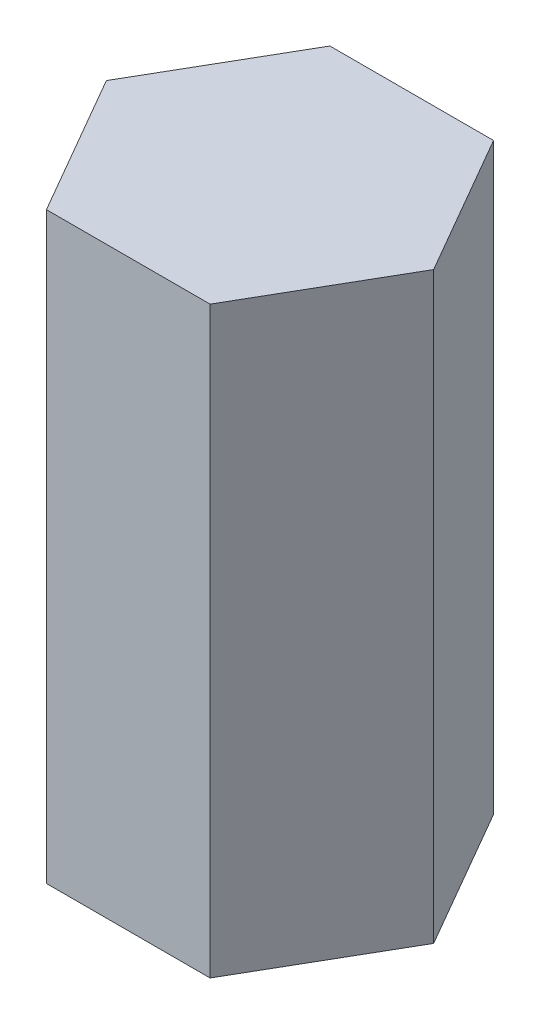
ISO-10303-21;
HEADER;
FILE_DESCRIPTION(('STEP AP214'),'2;1');
FILE_NAME('part.step','',(''),(''),'','','');
FILE_SCHEMA(('AUTOMOTIVE_DESIGN { 1 0 10303 214 1 1 1 1 }'));
ENDSEC;
DATA;
#1=APPLICATION_CONTEXT('core data for automotive mechanical design processes');
#2=APPLICATION_PROTOCOL_DEFINITION('international standard','automotive_design',2000,#1);
#3=PRODUCT_CONTEXT('',#1,'mechanical');
#4=PRODUCT('Part','Part','',(#3));
#5=PRODUCT_RELATED_PRODUCT_CATEGORY('part','',(#4));
#6=PRODUCT_DEFINITION_FORMATION('','',#4);
#7=PRODUCT_DEFINITION_CONTEXT('part definition',#1,'design');
#8=PRODUCT_DEFINITION('design','',#6,#7);
#9=PRODUCT_DEFINITION_SHAPE('','',#8);
#10=(LENGTH_UNIT() NAMED_UNIT(*) SI_UNIT(.MILLI.,.METRE.));
#11=(NAMED_UNIT(*) PLANE_ANGLE_UNIT() SI_UNIT($,.RADIAN.));
#12=(NAMED_UNIT(*) SI_UNIT($,.STERADIAN.) SOLID_ANGLE_UNIT());
#13=UNCERTAINTY_MEASURE_WITH_UNIT(LENGTH_MEASURE(1.E-05),#10,'distance_accuracy_value','');
#14=(GEOMETRIC_REPRESENTATION_CONTEXT(3) GLOBAL_UNCERTAINTY_ASSIGNED_CONTEXT((#13)) GLOBAL_UNIT_ASSIGNED_CONTEXT((#10,
#11,#12)) REPRESENTATION_CONTEXT('',''));
#15=CARTESIAN_POINT('',(0.,0.,0.));
#16=DIRECTION('',(0.,0.,1.));
#17=DIRECTION('',(1.,0.,0.));
#18=AXIS2_PLACEMENT_3D('',#15,#16,#17);
#19=CARTESIAN_POINT('',(0.,0.,0.));
#20=DIRECTION('',(0.,1.,0.));
#21=DIRECTION('',(0.,0.,1.));
#22=AXIS2_PLACEMENT_3D('',#19,#20,#21);
#23=PLANE('',#22);
#24=DIRECTION('',(1.,0.,0.));
#25=VECTOR('',#24,1.);
#26=CARTESIAN_POINT('',(0.,0.,8.50000000000001));
#27=LINE('',#26,#25);
#28=CARTESIAN_POINT('',(-4.90747728811181,0.,8.50000000000001));
#29=VERTEX_POINT('',#28);
#30=CARTESIAN_POINT('',(4.90747728811182,0.,8.50000000000001));
#31=VERTEX_POINT('',#30);
#32=EDGE_CURVE('E138',#29,#31,#27,.T.);
#33=ORIENTED_EDGE('',*,*,#32,.F.);
#34=DIRECTION('',(0.5,0.,0.866025403784439));
#35=VECTOR('',#34,1.);
#36=CARTESIAN_POINT('',(-7.36121593216772,0.,4.25));
#37=LINE('',#36,#35);
#38=CARTESIAN_POINT('',(-9.81495457622363,0.,0.));
#39=VERTEX_POINT('',#38);
#40=EDGE_CURVE('E134',#39,#29,#37,.T.);
#41=ORIENTED_EDGE('',*,*,#40,.F.);
#42=DIRECTION('',(-0.5,0.,0.866025403784439));
#43=VECTOR('',#42,1.);
#44=CARTESIAN_POINT('',(-4.90747728811182,0.,-8.5));
#45=LINE('',#44,#43);
#46=CARTESIAN_POINT('',(-4.90747728811182,0.,-8.5));
#47=VERTEX_POINT('',#46);
#48=EDGE_CURVE('E136',#47,#39,#45,.T.);
#49=ORIENTED_EDGE('',*,*,#48,.F.);
#50=DIRECTION('',(-1.,0.,0.));
#51=VECTOR('',#50,1.);
#52=CARTESIAN_POINT('',(4.90747728811182,0.,-8.5));
#53=LINE('',#52,#51);
#54=CARTESIAN_POINT('',(4.90747728811182,0.,-8.5));
#55=VERTEX_POINT('',#54);
#56=EDGE_CURVE('E128',#55,#47,#53,.T.);
#57=ORIENTED_EDGE('',*,*,#56,.F.);
#58=DIRECTION('',(-0.5,0.,-0.866025403784439));
#59=VECTOR('',#58,1.);
#60=CARTESIAN_POINT('',(9.81495457622364,0.,0.));
#61=LINE('',#60,#59);
#62=CARTESIAN_POINT('',(9.81495457622364,0.,0.));
#63=VERTEX_POINT('',#62);
#64=EDGE_CURVE('E189',#63,#55,#61,.T.);
#65=ORIENTED_EDGE('',*,*,#64,.F.);
#66=DIRECTION('',(0.5,0.,-0.866025403784439));
#67=VECTOR('',#66,1.);
#68=CARTESIAN_POINT('',(7.36121593216773,0.,4.25));
#69=LINE('',#68,#67);
#70=EDGE_CURVE('E144',#31,#63,#69,.T.);
#71=ORIENTED_EDGE('',*,*,#70,.F.);
#72=EDGE_LOOP('',(#33,#41,#49,#57,#65,#71));
#73=FACE_BOUND('',#72,.T.);
#74=ADVANCED_FACE('F75',(#73),#23,.F.);
#75=CARTESIAN_POINT('',(0.,35.,8.50000000000001));
#76=DIRECTION('',(0.,0.,-1.));
#77=DIRECTION('',(-1.,0.,0.));
#78=AXIS2_PLACEMENT_3D('',#75,#76,#77);
#79=PLANE('',#78);
#80=ORIENTED_EDGE('',*,*,#32,.T.);
#81=DIRECTION('',(0.,-1.,0.));
#82=VECTOR('',#81,1.);
#83=CARTESIAN_POINT('',(4.90747728811182,35.,8.50000000000001));
#84=LINE('',#83,#82);
#85=CARTESIAN_POINT('',(4.90747728811182,35.,8.50000000000001));
#86=VERTEX_POINT('',#85);
#87=EDGE_CURVE('E12',#86,#31,#84,.T.);
#88=ORIENTED_EDGE('',*,*,#87,.F.);
#89=DIRECTION('',(1.,0.,0.));
#90=VECTOR('',#89,1.);
#91=CARTESIAN_POINT('',(0.,35.,8.50000000000001));
#92=LINE('',#91,#90);
#93=CARTESIAN_POINT('',(-4.90747728811181,35.,8.50000000000001));
#94=VERTEX_POINT('',#93);
#95=EDGE_CURVE('E143',#94,#86,#92,.T.);
#96=ORIENTED_EDGE('',*,*,#95,.F.);
#97=DIRECTION('',(0.,-1.,0.));
#98=VECTOR('',#97,1.);
#99=CARTESIAN_POINT('',(-4.90747728811181,35.,8.50000000000001));
#100=LINE('',#99,#98);
#101=EDGE_CURVE('E86',#94,#29,#100,.T.);
#102=ORIENTED_EDGE('',*,*,#101,.T.);
#103=EDGE_LOOP('',(#80,#88,#96,#102));
#104=FACE_BOUND('',#103,.T.);
#105=ADVANCED_FACE('F197',(#104),#79,.F.);
#106=CARTESIAN_POINT('',(-7.36121593216772,35.,4.25));
#107=DIRECTION('',(0.866025403784439,0.,-0.5));
#108=DIRECTION('',(-0.5,0.,-0.866025403784439));
#109=AXIS2_PLACEMENT_3D('',#106,#107,#108);
#110=PLANE('',#109);
#111=ORIENTED_EDGE('',*,*,#40,.T.);
#112=ORIENTED_EDGE('',*,*,#101,.F.);
#113=DIRECTION('',(0.5,0.,0.866025403784439));
#114=VECTOR('',#113,1.);
#115=CARTESIAN_POINT('',(-7.36121593216772,35.,4.25));
#116=LINE('',#115,#114);
#117=CARTESIAN_POINT('',(-9.81495457622363,35.,0.));
#118=VERTEX_POINT('',#117);
#119=EDGE_CURVE('E95',#118,#94,#116,.T.);
#120=ORIENTED_EDGE('',*,*,#119,.F.);
#121=DIRECTION('',(0.,-1.,0.));
#122=VECTOR('',#121,1.);
#123=CARTESIAN_POINT('',(-9.81495457622363,35.,0.));
#124=LINE('',#123,#122);
#125=EDGE_CURVE('E150',#118,#39,#124,.T.);
#126=ORIENTED_EDGE('',*,*,#125,.T.);
#127=EDGE_LOOP('',(#111,#112,#120,#126));
#128=FACE_BOUND('',#127,.T.);
#129=ADVANCED_FACE('F155',(#128),#110,.F.);
#130=CARTESIAN_POINT('',(7.36121593216773,35.,4.25));
#131=DIRECTION('',(-0.866025403784439,0.,-0.5));
#132=DIRECTION('',(-0.5,0.,0.866025403784439));
#133=AXIS2_PLACEMENT_3D('',#130,#131,#132);
#134=PLANE('',#133);
#135=ORIENTED_EDGE('',*,*,#70,.T.);
#136=DIRECTION('',(0.,-1.,0.));
#137=VECTOR('',#136,1.);
#138=CARTESIAN_POINT('',(9.81495457622364,35.,0.));
#139=LINE('',#138,#137);
#140=CARTESIAN_POINT('',(9.81495457622364,35.,0.));
#141=VERTEX_POINT('',#140);
#142=EDGE_CURVE('E79',#141,#63,#139,.T.);
#143=ORIENTED_EDGE('',*,*,#142,.F.);
#144=DIRECTION('',(0.5,0.,-0.866025403784439));
#145=VECTOR('',#144,1.);
#146=CARTESIAN_POINT('',(7.36121593216773,35.,4.25));
#147=LINE('',#146,#145);
#148=EDGE_CURVE('E195',#86,#141,#147,.T.);
#149=ORIENTED_EDGE('',*,*,#148,.F.);
#150=ORIENTED_EDGE('',*,*,#87,.T.);
#151=EDGE_LOOP('',(#135,#143,#149,#150));
#152=FACE_BOUND('',#151,.T.);
#153=ADVANCED_FACE('F194',(#152),#134,.F.);
#154=CARTESIAN_POINT('',(0.,35.,0.));
#155=DIRECTION('',(0.,1.,0.));
#156=DIRECTION('',(0.,0.,1.));
#157=AXIS2_PLACEMENT_3D('',#154,#155,#156);
#158=PLANE('',#157);
#159=ORIENTED_EDGE('',*,*,#95,.T.);
#160=ORIENTED_EDGE('',*,*,#148,.T.);
#161=DIRECTION('',(-0.5,0.,-0.866025403784439));
#162=VECTOR('',#161,1.);
#163=CARTESIAN_POINT('',(9.81495457622364,35.,0.));
#164=LINE('',#163,#162);
#165=CARTESIAN_POINT('',(4.90747728811182,35.,-8.5));
#166=VERTEX_POINT('',#165);
#167=EDGE_CURVE('E153',#141,#166,#164,.T.);
#168=ORIENTED_EDGE('',*,*,#167,.T.);
#169=DIRECTION('',(-1.,0.,0.));
#170=VECTOR('',#169,1.);
#171=CARTESIAN_POINT('',(4.90747728811182,35.,-8.5));
#172=LINE('',#171,#170);
#173=CARTESIAN_POINT('',(-4.90747728811182,35.,-8.5));
#174=VERTEX_POINT('',#173);
#175=EDGE_CURVE('E163',#166,#174,#172,.T.);
#176=ORIENTED_EDGE('',*,*,#175,.T.);
#177=DIRECTION('',(-0.5,0.,0.866025403784439));
#178=VECTOR('',#177,1.);
#179=CARTESIAN_POINT('',(-4.90747728811182,35.,-8.5));
#180=LINE('',#179,#178);
#181=EDGE_CURVE('E157',#174,#118,#180,.T.);
#182=ORIENTED_EDGE('',*,*,#181,.T.);
#183=ORIENTED_EDGE('',*,*,#119,.T.);
#184=EDGE_LOOP('',(#159,#160,#168,#176,#182,#183));
#185=FACE_BOUND('',#184,.T.);
#186=ADVANCED_FACE('F202',(#185),#158,.T.);
#187=CARTESIAN_POINT('',(-4.90747728811182,35.,-8.5));
#188=DIRECTION('',(0.866025403784439,0.,0.5));
#189=DIRECTION('',(0.5,0.,-0.866025403784439));
#190=AXIS2_PLACEMENT_3D('',#187,#188,#189);
#191=PLANE('',#190);
#192=ORIENTED_EDGE('',*,*,#125,.F.);
#193=ORIENTED_EDGE('',*,*,#181,.F.);
#194=DIRECTION('',(0.,-1.,0.));
#195=VECTOR('',#194,1.);
#196=CARTESIAN_POINT('',(-4.90747728811182,35.,-8.5));
#197=LINE('',#196,#195);
#198=EDGE_CURVE('E151',#174,#47,#197,.T.);
#199=ORIENTED_EDGE('',*,*,#198,.T.);
#200=ORIENTED_EDGE('',*,*,#48,.T.);
#201=EDGE_LOOP('',(#192,#193,#199,#200));
#202=FACE_BOUND('',#201,.T.);
#203=ADVANCED_FACE('F148',(#202),#191,.F.);
#204=CARTESIAN_POINT('',(4.90747728811182,35.,-8.5));
#205=DIRECTION('',(0.,0.,1.));
#206=DIRECTION('',(1.,0.,0.));
#207=AXIS2_PLACEMENT_3D('',#204,#205,#206);
#208=PLANE('',#207);
#209=ORIENTED_EDGE('',*,*,#198,.F.);
#210=ORIENTED_EDGE('',*,*,#175,.F.);
#211=DIRECTION('',(0.,-1.,0.));
#212=VECTOR('',#211,1.);
#213=CARTESIAN_POINT('',(4.90747728811182,35.,-8.5));
#214=LINE('',#213,#212);
#215=EDGE_CURVE('E161',#166,#55,#214,.T.);
#216=ORIENTED_EDGE('',*,*,#215,.T.);
#217=ORIENTED_EDGE('',*,*,#56,.T.);
#218=EDGE_LOOP('',(#209,#210,#216,#217));
#219=FACE_BOUND('',#218,.T.);
#220=ADVANCED_FACE('F203',(#219),#208,.F.);
#221=CARTESIAN_POINT('',(9.81495457622364,35.,0.));
#222=DIRECTION('',(-0.866025403784439,0.,0.5));
#223=DIRECTION('',(0.5,0.,0.866025403784439));
#224=AXIS2_PLACEMENT_3D('',#221,#222,#223);
#225=PLANE('',#224);
#226=ORIENTED_EDGE('',*,*,#215,.F.);
#227=ORIENTED_EDGE('',*,*,#167,.F.);
#228=ORIENTED_EDGE('',*,*,#142,.T.);
#229=ORIENTED_EDGE('',*,*,#64,.T.);
#230=EDGE_LOOP('',(#226,#227,#228,#229));
#231=FACE_BOUND('',#230,.T.);
#232=ADVANCED_FACE('F77',(#231),#225,.F.);
#233=CLOSED_SHELL('',(#74,#105,#129,#153,#186,#203,#220,#232));
#234=MANIFOLD_SOLID_BREP('B2',#233);
#235=ADVANCED_BREP_SHAPE_REPRESENTATION('',(#18,#234),#14);
#236=SHAPE_DEFINITION_REPRESENTATION(#9,#235);
ENDSEC;
END-ISO-10303-21;
